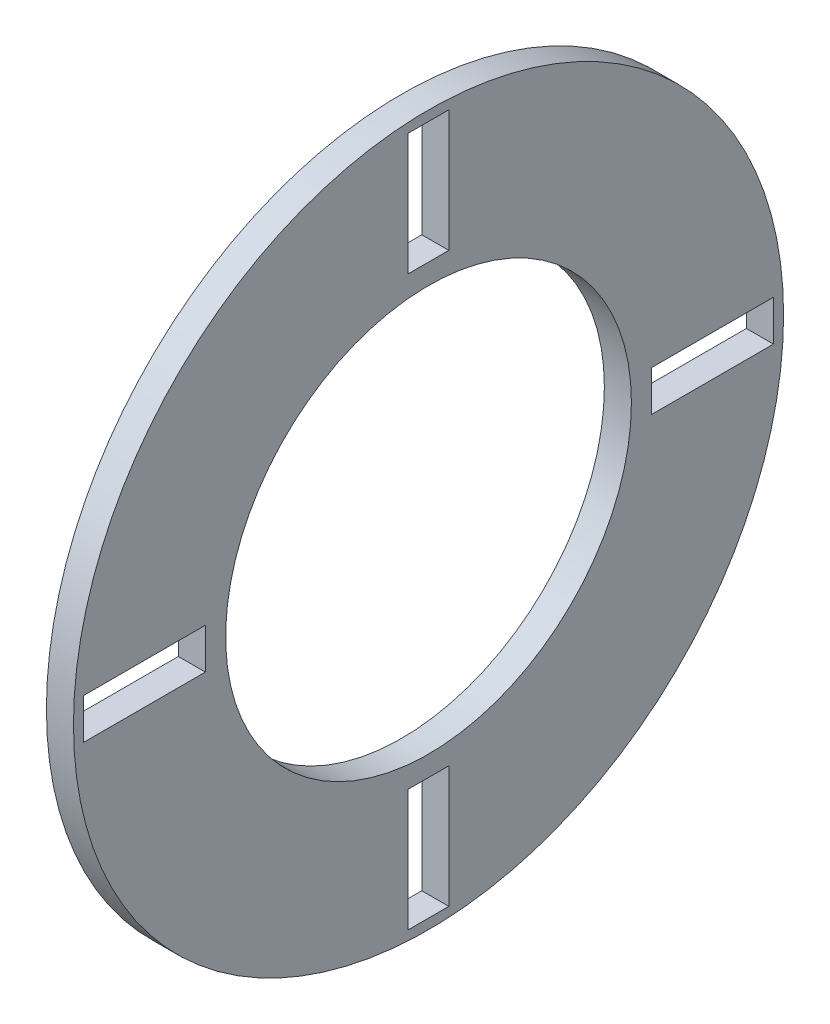
ISO-10303-21;
HEADER;
FILE_DESCRIPTION(('STEP AP214'),'2;1');
FILE_NAME('part.step','',(''),(''),'','','');
FILE_SCHEMA(('AUTOMOTIVE_DESIGN { 1 0 10303 214 1 1 1 1 }'));
ENDSEC;
DATA;
#1=APPLICATION_CONTEXT('core data for automotive mechanical design processes');
#2=APPLICATION_PROTOCOL_DEFINITION('international standard','automotive_design',2000,#1);
#3=PRODUCT_CONTEXT('',#1,'mechanical');
#4=PRODUCT('Part','Part','',(#3));
#5=PRODUCT_RELATED_PRODUCT_CATEGORY('part','',(#4));
#6=PRODUCT_DEFINITION_FORMATION('','',#4);
#7=PRODUCT_DEFINITION_CONTEXT('part definition',#1,'design');
#8=PRODUCT_DEFINITION('design','',#6,#7);
#9=PRODUCT_DEFINITION_SHAPE('','',#8);
#10=(LENGTH_UNIT() NAMED_UNIT(*) SI_UNIT(.MILLI.,.METRE.));
#11=(NAMED_UNIT(*) PLANE_ANGLE_UNIT() SI_UNIT($,.RADIAN.));
#12=(NAMED_UNIT(*) SI_UNIT($,.STERADIAN.) SOLID_ANGLE_UNIT());
#13=UNCERTAINTY_MEASURE_WITH_UNIT(LENGTH_MEASURE(1.E-05),#10,'distance_accuracy_value','');
#14=(GEOMETRIC_REPRESENTATION_CONTEXT(3) GLOBAL_UNCERTAINTY_ASSIGNED_CONTEXT((#13)) GLOBAL_UNIT_ASSIGNED_CONTEXT((#10,
#11,#12)) REPRESENTATION_CONTEXT('',''));
#15=CARTESIAN_POINT('',(0.,0.,0.));
#16=DIRECTION('',(0.,0.,1.));
#17=DIRECTION('',(1.,0.,0.));
#18=AXIS2_PLACEMENT_3D('',#15,#16,#17);
#19=CARTESIAN_POINT('',(1.,0.,0.));
#20=DIRECTION('',(-1.,0.,0.));
#21=DIRECTION('',(0.,0.,1.));
#22=AXIS2_PLACEMENT_3D('',#19,#20,#21);
#23=CYLINDRICAL_SURFACE('',#22,10.);
#24=CARTESIAN_POINT('',(0.33335,0.,0.));
#25=DIRECTION('',(-1.,0.,0.));
#26=DIRECTION('',(0.,0.,1.));
#27=AXIS2_PLACEMENT_3D('',#24,#25,#26);
#28=CIRCLE('',#27,10.);
#29=CARTESIAN_POINT('',(0.33335,0.,-10.));
#30=VERTEX_POINT('',#29);
#31=EDGE_CURVE('E10',#30,#30,#28,.T.);
#32=ORIENTED_EDGE('',*,*,#31,.T.);
#33=EDGE_LOOP('',(#32));
#34=FACE_BOUND('',#33,.T.);
#35=CARTESIAN_POINT('',(1.66665,0.,0.));
#36=DIRECTION('',(-1.,0.,0.));
#37=DIRECTION('',(0.,0.,1.));
#38=AXIS2_PLACEMENT_3D('',#35,#36,#37);
#39=CIRCLE('',#38,10.);
#40=CARTESIAN_POINT('',(1.66665,0.,-10.));
#41=VERTEX_POINT('',#40);
#42=EDGE_CURVE('E323',#41,#41,#39,.T.);
#43=ORIENTED_EDGE('',*,*,#42,.F.);
#44=EDGE_LOOP('',(#43));
#45=FACE_BOUND('',#44,.T.);
#46=ADVANCED_FACE('F16',(#34,#45),#23,.F.);
#47=CARTESIAN_POINT('',(1.,0.,0.));
#48=DIRECTION('',(-1.,0.,0.));
#49=DIRECTION('',(0.,0.,1.));
#50=AXIS2_PLACEMENT_3D('',#47,#48,#49);
#51=CYLINDRICAL_SURFACE('',#50,17.5);
#52=CARTESIAN_POINT('',(0.33335,0.,0.));
#53=DIRECTION('',(-1.,0.,0.));
#54=DIRECTION('',(0.,0.,1.));
#55=AXIS2_PLACEMENT_3D('',#52,#53,#54);
#56=CIRCLE('',#55,17.5);
#57=CARTESIAN_POINT('',(0.33335,0.,-17.5));
#58=VERTEX_POINT('',#57);
#59=EDGE_CURVE('E286',#58,#58,#56,.T.);
#60=ORIENTED_EDGE('',*,*,#59,.F.);
#61=EDGE_LOOP('',(#60));
#62=FACE_BOUND('',#61,.T.);
#63=CARTESIAN_POINT('',(1.66665,0.,0.));
#64=DIRECTION('',(-1.,0.,0.));
#65=DIRECTION('',(0.,0.,1.));
#66=AXIS2_PLACEMENT_3D('',#63,#64,#65);
#67=CIRCLE('',#66,17.5);
#68=CARTESIAN_POINT('',(1.66665,0.,-17.5));
#69=VERTEX_POINT('',#68);
#70=EDGE_CURVE('E27',#69,#69,#67,.T.);
#71=ORIENTED_EDGE('',*,*,#70,.T.);
#72=EDGE_LOOP('',(#71));
#73=FACE_BOUND('',#72,.T.);
#74=ADVANCED_FACE('F504',(#62,#73),#51,.T.);
#75=CARTESIAN_POINT('',(1.,17.,0.));
#76=DIRECTION('',(0.,-1.,0.));
#77=DIRECTION('',(0.,0.,-1.));
#78=AXIS2_PLACEMENT_3D('',#75,#76,#77);
#79=PLANE('',#78);
#80=DIRECTION('',(0.,0.,-1.));
#81=VECTOR('',#80,1.);
#82=CARTESIAN_POINT('',(1.66665,17.,6.875));
#83=LINE('',#82,#81);
#84=CARTESIAN_POINT('',(1.66665,17.,1.));
#85=VERTEX_POINT('',#84);
#86=CARTESIAN_POINT('',(1.66665,17.,-1.));
#87=VERTEX_POINT('',#86);
#88=EDGE_CURVE('E301',#85,#87,#83,.T.);
#89=ORIENTED_EDGE('',*,*,#88,.F.);
#90=DIRECTION('',(-1.,0.,0.));
#91=VECTOR('',#90,1.);
#92=CARTESIAN_POINT('',(1.,17.,1.));
#93=LINE('',#92,#91);
#94=CARTESIAN_POINT('',(0.33335,17.,1.));
#95=VERTEX_POINT('',#94);
#96=EDGE_CURVE('E20',#85,#95,#93,.T.);
#97=ORIENTED_EDGE('',*,*,#96,.T.);
#98=DIRECTION('',(0.,0.,1.));
#99=VECTOR('',#98,1.);
#100=CARTESIAN_POINT('',(0.33335,17.,6.875));
#101=LINE('',#100,#99);
#102=CARTESIAN_POINT('',(0.33335,17.,-1.));
#103=VERTEX_POINT('',#102);
#104=EDGE_CURVE('E257',#103,#95,#101,.T.);
#105=ORIENTED_EDGE('',*,*,#104,.F.);
#106=DIRECTION('',(-1.,0.,0.));
#107=VECTOR('',#106,1.);
#108=CARTESIAN_POINT('',(1.,17.,-1.));
#109=LINE('',#108,#107);
#110=EDGE_CURVE('E272',#87,#103,#109,.T.);
#111=ORIENTED_EDGE('',*,*,#110,.F.);
#112=EDGE_LOOP('',(#89,#97,#105,#111));
#113=FACE_BOUND('',#112,.T.);
#114=ADVANCED_FACE('F413',(#113),#79,.T.);
#115=CARTESIAN_POINT('',(1.,14.,-1.));
#116=DIRECTION('',(0.,0.,1.));
#117=DIRECTION('',(1.,0.,0.));
#118=AXIS2_PLACEMENT_3D('',#115,#116,#117);
#119=PLANE('',#118);
#120=DIRECTION('',(0.,-1.,0.));
#121=VECTOR('',#120,1.);
#122=CARTESIAN_POINT('',(1.66665,7.,-1.));
#123=LINE('',#122,#121);
#124=CARTESIAN_POINT('',(1.66665,11.,-1.));
#125=VERTEX_POINT('',#124);
#126=EDGE_CURVE('E298',#87,#125,#123,.T.);
#127=ORIENTED_EDGE('',*,*,#126,.F.);
#128=ORIENTED_EDGE('',*,*,#110,.T.);
#129=DIRECTION('',(0.,1.,0.));
#130=VECTOR('',#129,1.);
#131=CARTESIAN_POINT('',(0.33335,7.,-1.));
#132=LINE('',#131,#130);
#133=CARTESIAN_POINT('',(0.33335,11.,-1.));
#134=VERTEX_POINT('',#133);
#135=EDGE_CURVE('E260',#134,#103,#132,.T.);
#136=ORIENTED_EDGE('',*,*,#135,.F.);
#137=DIRECTION('',(-1.,0.,0.));
#138=VECTOR('',#137,1.);
#139=CARTESIAN_POINT('',(1.,11.,-1.));
#140=LINE('',#139,#138);
#141=EDGE_CURVE('E253',#125,#134,#140,.T.);
#142=ORIENTED_EDGE('',*,*,#141,.F.);
#143=EDGE_LOOP('',(#127,#128,#136,#142));
#144=FACE_BOUND('',#143,.T.);
#145=ADVANCED_FACE('F409',(#144),#119,.T.);
#146=CARTESIAN_POINT('',(1.,11.,0.));
#147=DIRECTION('',(0.,1.,0.));
#148=DIRECTION('',(1.,0.,0.));
#149=AXIS2_PLACEMENT_3D('',#146,#147,#148);
#150=PLANE('',#149);
#151=DIRECTION('',(0.,0.,1.));
#152=VECTOR('',#151,1.);
#153=CARTESIAN_POINT('',(1.66665,11.,6.875));
#154=LINE('',#153,#152);
#155=CARTESIAN_POINT('',(1.66665,11.,1.));
#156=VERTEX_POINT('',#155);
#157=EDGE_CURVE('E205',#125,#156,#154,.T.);
#158=ORIENTED_EDGE('',*,*,#157,.F.);
#159=ORIENTED_EDGE('',*,*,#141,.T.);
#160=DIRECTION('',(0.,0.,-1.));
#161=VECTOR('',#160,1.);
#162=CARTESIAN_POINT('',(0.33335,11.,6.875));
#163=LINE('',#162,#161);
#164=CARTESIAN_POINT('',(0.33335,11.,1.));
#165=VERTEX_POINT('',#164);
#166=EDGE_CURVE('E282',#165,#134,#163,.T.);
#167=ORIENTED_EDGE('',*,*,#166,.F.);
#168=DIRECTION('',(-1.,0.,0.));
#169=VECTOR('',#168,1.);
#170=CARTESIAN_POINT('',(1.,11.,1.));
#171=LINE('',#170,#169);
#172=EDGE_CURVE('E249',#156,#165,#171,.T.);
#173=ORIENTED_EDGE('',*,*,#172,.F.);
#174=EDGE_LOOP('',(#158,#159,#167,#173));
#175=FACE_BOUND('',#174,.T.);
#176=ADVANCED_FACE('F360',(#175),#150,.T.);
#177=CARTESIAN_POINT('',(1.,14.,1.));
#178=DIRECTION('',(0.,0.,-1.));
#179=DIRECTION('',(0.,-1.,0.));
#180=AXIS2_PLACEMENT_3D('',#177,#178,#179);
#181=PLANE('',#180);
#182=DIRECTION('',(0.,1.,0.));
#183=VECTOR('',#182,1.);
#184=CARTESIAN_POINT('',(1.66665,7.,1.));
#185=LINE('',#184,#183);
#186=EDGE_CURVE('E306',#156,#85,#185,.T.);
#187=ORIENTED_EDGE('',*,*,#186,.F.);
#188=ORIENTED_EDGE('',*,*,#172,.T.);
#189=DIRECTION('',(0.,-1.,0.));
#190=VECTOR('',#189,1.);
#191=CARTESIAN_POINT('',(0.33335,7.,1.));
#192=LINE('',#191,#190);
#193=EDGE_CURVE('E261',#95,#165,#192,.T.);
#194=ORIENTED_EDGE('',*,*,#193,.F.);
#195=ORIENTED_EDGE('',*,*,#96,.F.);
#196=EDGE_LOOP('',(#187,#188,#194,#195));
#197=FACE_BOUND('',#196,.T.);
#198=ADVANCED_FACE('F18',(#197),#181,.T.);
#199=CARTESIAN_POINT('',(1.,0.,-17.));
#200=DIRECTION('',(0.,0.,1.));
#201=DIRECTION('',(1.,0.,0.));
#202=AXIS2_PLACEMENT_3D('',#199,#200,#201);
#203=PLANE('',#202);
#204=DIRECTION('',(0.,-1.,0.));
#205=VECTOR('',#204,1.);
#206=CARTESIAN_POINT('',(1.66665,0.,-17.));
#207=LINE('',#206,#205);
#208=CARTESIAN_POINT('',(1.66665,1.,-17.));
#209=VERTEX_POINT('',#208);
#210=CARTESIAN_POINT('',(1.66665,-1.,-17.));
#211=VERTEX_POINT('',#210);
#212=EDGE_CURVE('E207',#209,#211,#207,.T.);
#213=ORIENTED_EDGE('',*,*,#212,.F.);
#214=DIRECTION('',(-1.,0.,0.));
#215=VECTOR('',#214,1.);
#216=CARTESIAN_POINT('',(1.,1.,-17.));
#217=LINE('',#216,#215);
#218=CARTESIAN_POINT('',(0.33335,1.,-17.));
#219=VERTEX_POINT('',#218);
#220=EDGE_CURVE('E254',#209,#219,#217,.T.);
#221=ORIENTED_EDGE('',*,*,#220,.T.);
#222=DIRECTION('',(0.,1.,0.));
#223=VECTOR('',#222,1.);
#224=CARTESIAN_POINT('',(0.33335,0.,-17.));
#225=LINE('',#224,#223);
#226=CARTESIAN_POINT('',(0.33335,-1.,-17.));
#227=VERTEX_POINT('',#226);
#228=EDGE_CURVE('E233',#227,#219,#225,.T.);
#229=ORIENTED_EDGE('',*,*,#228,.F.);
#230=DIRECTION('',(-1.,0.,0.));
#231=VECTOR('',#230,1.);
#232=CARTESIAN_POINT('',(1.,-1.,-17.));
#233=LINE('',#232,#231);
#234=EDGE_CURVE('E281',#211,#227,#233,.T.);
#235=ORIENTED_EDGE('',*,*,#234,.F.);
#236=EDGE_LOOP('',(#213,#221,#229,#235));
#237=FACE_BOUND('',#236,.T.);
#238=ADVANCED_FACE('F485',(#237),#203,.T.);
#239=CARTESIAN_POINT('',(1.,-1.,-14.));
#240=DIRECTION('',(0.,1.,0.));
#241=DIRECTION('',(1.,0.,0.));
#242=AXIS2_PLACEMENT_3D('',#239,#240,#241);
#243=PLANE('',#242);
#244=DIRECTION('',(0.,0.,1.));
#245=VECTOR('',#244,1.);
#246=CARTESIAN_POINT('',(1.66665,-1.,-0.125));
#247=LINE('',#246,#245);
#248=CARTESIAN_POINT('',(1.66665,-1.,-11.));
#249=VERTEX_POINT('',#248);
#250=EDGE_CURVE('E209',#211,#249,#247,.T.);
#251=ORIENTED_EDGE('',*,*,#250,.F.);
#252=ORIENTED_EDGE('',*,*,#234,.T.);
#253=DIRECTION('',(0.,0.,-1.));
#254=VECTOR('',#253,1.);
#255=CARTESIAN_POINT('',(0.33335,-1.,-0.125));
#256=LINE('',#255,#254);
#257=CARTESIAN_POINT('',(0.33335,-1.,-11.));
#258=VERTEX_POINT('',#257);
#259=EDGE_CURVE('E228',#258,#227,#256,.T.);
#260=ORIENTED_EDGE('',*,*,#259,.F.);
#261=DIRECTION('',(-1.,0.,0.));
#262=VECTOR('',#261,1.);
#263=CARTESIAN_POINT('',(1.,-1.,-11.));
#264=LINE('',#263,#262);
#265=EDGE_CURVE('E238',#249,#258,#264,.T.);
#266=ORIENTED_EDGE('',*,*,#265,.F.);
#267=EDGE_LOOP('',(#251,#252,#260,#266));
#268=FACE_BOUND('',#267,.T.);
#269=ADVANCED_FACE('F480',(#268),#243,.T.);
#270=CARTESIAN_POINT('',(1.,0.,-11.));
#271=DIRECTION('',(0.,0.,-1.));
#272=DIRECTION('',(-1.,0.,0.));
#273=AXIS2_PLACEMENT_3D('',#270,#271,#272);
#274=PLANE('',#273);
#275=DIRECTION('',(0.,1.,0.));
#276=VECTOR('',#275,1.);
#277=CARTESIAN_POINT('',(1.66665,0.,-11.));
#278=LINE('',#277,#276);
#279=CARTESIAN_POINT('',(1.66665,1.,-11.));
#280=VERTEX_POINT('',#279);
#281=EDGE_CURVE('E214',#249,#280,#278,.T.);
#282=ORIENTED_EDGE('',*,*,#281,.F.);
#283=ORIENTED_EDGE('',*,*,#265,.T.);
#284=DIRECTION('',(0.,-1.,0.));
#285=VECTOR('',#284,1.);
#286=CARTESIAN_POINT('',(0.33335,0.,-11.));
#287=LINE('',#286,#285);
#288=CARTESIAN_POINT('',(0.33335,1.,-11.));
#289=VERTEX_POINT('',#288);
#290=EDGE_CURVE('E232',#289,#258,#287,.T.);
#291=ORIENTED_EDGE('',*,*,#290,.F.);
#292=DIRECTION('',(-1.,0.,0.));
#293=VECTOR('',#292,1.);
#294=CARTESIAN_POINT('',(1.,1.,-11.));
#295=LINE('',#294,#293);
#296=EDGE_CURVE('E234',#280,#289,#295,.T.);
#297=ORIENTED_EDGE('',*,*,#296,.F.);
#298=EDGE_LOOP('',(#282,#283,#291,#297));
#299=FACE_BOUND('',#298,.T.);
#300=ADVANCED_FACE('F473',(#299),#274,.T.);
#301=CARTESIAN_POINT('',(1.,1.,-14.));
#302=DIRECTION('',(0.,-1.,0.));
#303=DIRECTION('',(-1.,0.,0.));
#304=AXIS2_PLACEMENT_3D('',#301,#302,#303);
#305=PLANE('',#304);
#306=DIRECTION('',(0.,0.,-1.));
#307=VECTOR('',#306,1.);
#308=CARTESIAN_POINT('',(1.66665,1.,-0.125));
#309=LINE('',#308,#307);
#310=EDGE_CURVE('E208',#280,#209,#309,.T.);
#311=ORIENTED_EDGE('',*,*,#310,.F.);
#312=ORIENTED_EDGE('',*,*,#296,.T.);
#313=DIRECTION('',(0.,0.,1.));
#314=VECTOR('',#313,1.);
#315=CARTESIAN_POINT('',(0.33335,1.,-0.125));
#316=LINE('',#315,#314);
#317=EDGE_CURVE('E244',#219,#289,#316,.T.);
#318=ORIENTED_EDGE('',*,*,#317,.F.);
#319=ORIENTED_EDGE('',*,*,#220,.F.);
#320=EDGE_LOOP('',(#311,#312,#318,#319));
#321=FACE_BOUND('',#320,.T.);
#322=ADVANCED_FACE('F468',(#321),#305,.T.);
#323=CARTESIAN_POINT('',(1.,-17.,0.));
#324=DIRECTION('',(0.,1.,0.));
#325=DIRECTION('',(1.,0.,0.));
#326=AXIS2_PLACEMENT_3D('',#323,#324,#325);
#327=PLANE('',#326);
#328=DIRECTION('',(0.,0.,1.));
#329=VECTOR('',#328,1.);
#330=CARTESIAN_POINT('',(1.66665,-17.,6.875));
#331=LINE('',#330,#329);
#332=CARTESIAN_POINT('',(1.66665,-17.,-1.));
#333=VERTEX_POINT('',#332);
#334=CARTESIAN_POINT('',(1.66665,-17.,1.));
#335=VERTEX_POINT('',#334);
#336=EDGE_CURVE('E262',#333,#335,#331,.T.);
#337=ORIENTED_EDGE('',*,*,#336,.F.);
#338=DIRECTION('',(-1.,0.,0.));
#339=VECTOR('',#338,1.);
#340=CARTESIAN_POINT('',(1.,-17.,-1.));
#341=LINE('',#340,#339);
#342=CARTESIAN_POINT('',(0.33335,-17.,-1.));
#343=VERTEX_POINT('',#342);
#344=EDGE_CURVE('E239',#333,#343,#341,.T.);
#345=ORIENTED_EDGE('',*,*,#344,.T.);
#346=DIRECTION('',(0.,0.,-1.));
#347=VECTOR('',#346,1.);
#348=CARTESIAN_POINT('',(0.33335,-17.,6.875));
#349=LINE('',#348,#347);
#350=CARTESIAN_POINT('',(0.33335,-17.,1.));
#351=VERTEX_POINT('',#350);
#352=EDGE_CURVE('E201',#351,#343,#349,.T.);
#353=ORIENTED_EDGE('',*,*,#352,.F.);
#354=DIRECTION('',(-1.,0.,0.));
#355=VECTOR('',#354,1.);
#356=CARTESIAN_POINT('',(1.,-17.,1.));
#357=LINE('',#356,#355);
#358=EDGE_CURVE('E307',#335,#351,#357,.T.);
#359=ORIENTED_EDGE('',*,*,#358,.F.);
#360=EDGE_LOOP('',(#337,#345,#353,#359));
#361=FACE_BOUND('',#360,.T.);
#362=ADVANCED_FACE('F376',(#361),#327,.T.);
#363=CARTESIAN_POINT('',(1.,-14.,1.));
#364=DIRECTION('',(0.,0.,-1.));
#365=DIRECTION('',(0.,-1.,0.));
#366=AXIS2_PLACEMENT_3D('',#363,#364,#365);
#367=PLANE('',#366);
#368=DIRECTION('',(0.,1.,0.));
#369=VECTOR('',#368,1.);
#370=CARTESIAN_POINT('',(1.66665,-7.,1.));
#371=LINE('',#370,#369);
#372=CARTESIAN_POINT('',(1.66665,-11.,1.));
#373=VERTEX_POINT('',#372);
#374=EDGE_CURVE('E266',#335,#373,#371,.T.);
#375=ORIENTED_EDGE('',*,*,#374,.F.);
#376=ORIENTED_EDGE('',*,*,#358,.T.);
#377=DIRECTION('',(0.,-1.,0.));
#378=VECTOR('',#377,1.);
#379=CARTESIAN_POINT('',(0.33335,-7.,1.));
#380=LINE('',#379,#378);
#381=CARTESIAN_POINT('',(0.33335,-11.,1.));
#382=VERTEX_POINT('',#381);
#383=EDGE_CURVE('E245',#382,#351,#380,.T.);
#384=ORIENTED_EDGE('',*,*,#383,.F.);
#385=DIRECTION('',(-1.,0.,0.));
#386=VECTOR('',#385,1.);
#387=CARTESIAN_POINT('',(1.,-11.,1.));
#388=LINE('',#387,#386);
#389=EDGE_CURVE('E226',#373,#382,#388,.T.);
#390=ORIENTED_EDGE('',*,*,#389,.F.);
#391=EDGE_LOOP('',(#375,#376,#384,#390));
#392=FACE_BOUND('',#391,.T.);
#393=ADVANCED_FACE('F382',(#392),#367,.T.);
#394=CARTESIAN_POINT('',(1.,-11.,0.));
#395=DIRECTION('',(0.,-1.,0.));
#396=DIRECTION('',(-1.,0.,0.));
#397=AXIS2_PLACEMENT_3D('',#394,#395,#396);
#398=PLANE('',#397);
#399=DIRECTION('',(0.,0.,-1.));
#400=VECTOR('',#399,1.);
#401=CARTESIAN_POINT('',(1.66665,-11.,6.875));
#402=LINE('',#401,#400);
#403=CARTESIAN_POINT('',(1.66665,-11.,-1.));
#404=VERTEX_POINT('',#403);
#405=EDGE_CURVE('E314',#373,#404,#402,.T.);
#406=ORIENTED_EDGE('',*,*,#405,.F.);
#407=ORIENTED_EDGE('',*,*,#389,.T.);
#408=DIRECTION('',(0.,0.,1.));
#409=VECTOR('',#408,1.);
#410=CARTESIAN_POINT('',(0.33335,-11.,6.875));
#411=LINE('',#410,#409);
#412=CARTESIAN_POINT('',(0.33335,-11.,-1.));
#413=VERTEX_POINT('',#412);
#414=EDGE_CURVE('E240',#413,#382,#411,.T.);
#415=ORIENTED_EDGE('',*,*,#414,.F.);
#416=DIRECTION('',(-1.,0.,0.));
#417=VECTOR('',#416,1.);
#418=CARTESIAN_POINT('',(1.,-11.,-1.));
#419=LINE('',#418,#417);
#420=EDGE_CURVE('E222',#404,#413,#419,.T.);
#421=ORIENTED_EDGE('',*,*,#420,.F.);
#422=EDGE_LOOP('',(#406,#407,#415,#421));
#423=FACE_BOUND('',#422,.T.);
#424=ADVANCED_FACE('F388',(#423),#398,.T.);
#425=CARTESIAN_POINT('',(1.,-14.,-1.));
#426=DIRECTION('',(0.,0.,1.));
#427=DIRECTION('',(1.,0.,0.));
#428=AXIS2_PLACEMENT_3D('',#425,#426,#427);
#429=PLANE('',#428);
#430=DIRECTION('',(0.,-1.,0.));
#431=VECTOR('',#430,1.);
#432=CARTESIAN_POINT('',(1.66665,-7.,-1.));
#433=LINE('',#432,#431);
#434=EDGE_CURVE('E265',#404,#333,#433,.T.);
#435=ORIENTED_EDGE('',*,*,#434,.F.);
#436=ORIENTED_EDGE('',*,*,#420,.T.);
#437=DIRECTION('',(0.,1.,0.));
#438=VECTOR('',#437,1.);
#439=CARTESIAN_POINT('',(0.33335,-7.,-1.));
#440=LINE('',#439,#438);
#441=EDGE_CURVE('E194',#343,#413,#440,.T.);
#442=ORIENTED_EDGE('',*,*,#441,.F.);
#443=ORIENTED_EDGE('',*,*,#344,.F.);
#444=EDGE_LOOP('',(#435,#436,#442,#443));
#445=FACE_BOUND('',#444,.T.);
#446=ADVANCED_FACE('F391',(#445),#429,.T.);
#447=CARTESIAN_POINT('',(1.,0.,17.));
#448=DIRECTION('',(0.,0.,-1.));
#449=DIRECTION('',(0.,-1.,0.));
#450=AXIS2_PLACEMENT_3D('',#447,#448,#449);
#451=PLANE('',#450);
#452=DIRECTION('',(0.,1.,0.));
#453=VECTOR('',#452,1.);
#454=CARTESIAN_POINT('',(1.66665,0.,17.));
#455=LINE('',#454,#453);
#456=CARTESIAN_POINT('',(1.66665,-1.,17.));
#457=VERTEX_POINT('',#456);
#458=CARTESIAN_POINT('',(1.66665,1.,17.));
#459=VERTEX_POINT('',#458);
#460=EDGE_CURVE('E219',#457,#459,#455,.T.);
#461=ORIENTED_EDGE('',*,*,#460,.F.);
#462=DIRECTION('',(-1.,0.,0.));
#463=VECTOR('',#462,1.);
#464=CARTESIAN_POINT('',(1.,-1.,17.));
#465=LINE('',#464,#463);
#466=CARTESIAN_POINT('',(0.33335,-1.,17.));
#467=VERTEX_POINT('',#466);
#468=EDGE_CURVE('E227',#457,#467,#465,.T.);
#469=ORIENTED_EDGE('',*,*,#468,.T.);
#470=DIRECTION('',(0.,-1.,0.));
#471=VECTOR('',#470,1.);
#472=CARTESIAN_POINT('',(0.33335,0.,17.));
#473=LINE('',#472,#471);
#474=CARTESIAN_POINT('',(0.33335,1.,17.));
#475=VERTEX_POINT('',#474);
#476=EDGE_CURVE('E182',#475,#467,#473,.T.);
#477=ORIENTED_EDGE('',*,*,#476,.F.);
#478=DIRECTION('',(-1.,0.,0.));
#479=VECTOR('',#478,1.);
#480=CARTESIAN_POINT('',(1.,1.,17.));
#481=LINE('',#480,#479);
#482=EDGE_CURVE('E178',#459,#475,#481,.T.);
#483=ORIENTED_EDGE('',*,*,#482,.F.);
#484=EDGE_LOOP('',(#461,#469,#477,#483));
#485=FACE_BOUND('',#484,.T.);
#486=ADVANCED_FACE('F418',(#485),#451,.T.);
#487=CARTESIAN_POINT('',(1.,1.,14.));
#488=DIRECTION('',(0.,-1.,0.));
#489=DIRECTION('',(-1.,0.,0.));
#490=AXIS2_PLACEMENT_3D('',#487,#488,#489);
#491=PLANE('',#490);
#492=DIRECTION('',(0.,0.,-1.));
#493=VECTOR('',#492,1.);
#494=CARTESIAN_POINT('',(1.66665,1.,13.875));
#495=LINE('',#494,#493);
#496=CARTESIAN_POINT('',(1.66665,1.,11.));
#497=VERTEX_POINT('',#496);
#498=EDGE_CURVE('E165',#459,#497,#495,.T.);
#499=ORIENTED_EDGE('',*,*,#498,.F.);
#500=ORIENTED_EDGE('',*,*,#482,.T.);
#501=DIRECTION('',(0.,0.,1.));
#502=VECTOR('',#501,1.);
#503=CARTESIAN_POINT('',(0.33335,1.,13.875));
#504=LINE('',#503,#502);
#505=CARTESIAN_POINT('',(0.33335,1.,11.));
#506=VERTEX_POINT('',#505);
#507=EDGE_CURVE('E173',#506,#475,#504,.T.);
#508=ORIENTED_EDGE('',*,*,#507,.F.);
#509=DIRECTION('',(-1.,0.,0.));
#510=VECTOR('',#509,1.);
#511=CARTESIAN_POINT('',(1.,1.,11.));
#512=LINE('',#511,#510);
#513=EDGE_CURVE('E175',#497,#506,#512,.T.);
#514=ORIENTED_EDGE('',*,*,#513,.F.);
#515=EDGE_LOOP('',(#499,#500,#508,#514));
#516=FACE_BOUND('',#515,.T.);
#517=ADVANCED_FACE('F174',(#516),#491,.T.);
#518=CARTESIAN_POINT('',(1.,0.,11.));
#519=DIRECTION('',(0.,0.,1.));
#520=DIRECTION('',(1.,0.,0.));
#521=AXIS2_PLACEMENT_3D('',#518,#519,#520);
#522=PLANE('',#521);
#523=DIRECTION('',(0.,-1.,0.));
#524=VECTOR('',#523,1.);
#525=CARTESIAN_POINT('',(1.66665,0.,11.));
#526=LINE('',#525,#524);
#527=CARTESIAN_POINT('',(1.66665,-1.,11.));
#528=VERTEX_POINT('',#527);
#529=EDGE_CURVE('E185',#497,#528,#526,.T.);
#530=ORIENTED_EDGE('',*,*,#529,.F.);
#531=ORIENTED_EDGE('',*,*,#513,.T.);
#532=DIRECTION('',(0.,1.,0.));
#533=VECTOR('',#532,1.);
#534=CARTESIAN_POINT('',(0.33335,0.,11.));
#535=LINE('',#534,#533);
#536=CARTESIAN_POINT('',(0.33335,-1.,11.));
#537=VERTEX_POINT('',#536);
#538=EDGE_CURVE('E158',#537,#506,#535,.T.);
#539=ORIENTED_EDGE('',*,*,#538,.F.);
#540=DIRECTION('',(-1.,0.,0.));
#541=VECTOR('',#540,1.);
#542=CARTESIAN_POINT('',(1.,-1.,11.));
#543=LINE('',#542,#541);
#544=EDGE_CURVE('E187',#528,#537,#543,.T.);
#545=ORIENTED_EDGE('',*,*,#544,.F.);
#546=EDGE_LOOP('',(#530,#531,#539,#545));
#547=FACE_BOUND('',#546,.T.);
#548=ADVANCED_FACE('F184',(#547),#522,.T.);
#549=CARTESIAN_POINT('',(1.,-1.,14.));
#550=DIRECTION('',(0.,1.,0.));
#551=DIRECTION('',(1.,0.,0.));
#552=AXIS2_PLACEMENT_3D('',#549,#550,#551);
#553=PLANE('',#552);
#554=DIRECTION('',(0.,0.,1.));
#555=VECTOR('',#554,1.);
#556=CARTESIAN_POINT('',(1.66665,-1.,13.875));
#557=LINE('',#556,#555);
#558=EDGE_CURVE('E215',#528,#457,#557,.T.);
#559=ORIENTED_EDGE('',*,*,#558,.F.);
#560=ORIENTED_EDGE('',*,*,#544,.T.);
#561=DIRECTION('',(0.,0.,-1.));
#562=VECTOR('',#561,1.);
#563=CARTESIAN_POINT('',(0.33335,-1.,13.875));
#564=LINE('',#563,#562);
#565=EDGE_CURVE('E192',#467,#537,#564,.T.);
#566=ORIENTED_EDGE('',*,*,#565,.F.);
#567=ORIENTED_EDGE('',*,*,#468,.F.);
#568=EDGE_LOOP('',(#559,#560,#566,#567));
#569=FACE_BOUND('',#568,.T.);
#570=ADVANCED_FACE('F439',(#569),#553,.T.);
#571=CARTESIAN_POINT('',(1.66665,0.,13.75));
#572=DIRECTION('',(1.,0.,0.));
#573=DIRECTION('',(0.,1.,0.));
#574=AXIS2_PLACEMENT_3D('',#571,#572,#573);
#575=PLANE('',#574);
#576=ORIENTED_EDGE('',*,*,#70,.F.);
#577=EDGE_LOOP('',(#576));
#578=FACE_BOUND('',#577,.T.);
#579=ORIENTED_EDGE('',*,*,#157,.T.);
#580=ORIENTED_EDGE('',*,*,#186,.T.);
#581=ORIENTED_EDGE('',*,*,#88,.T.);
#582=ORIENTED_EDGE('',*,*,#126,.T.);
#583=EDGE_LOOP('',(#579,#580,#581,#582));
#584=FACE_BOUND('',#583,.T.);
#585=ORIENTED_EDGE('',*,*,#281,.T.);
#586=ORIENTED_EDGE('',*,*,#310,.T.);
#587=ORIENTED_EDGE('',*,*,#212,.T.);
#588=ORIENTED_EDGE('',*,*,#250,.T.);
#589=EDGE_LOOP('',(#585,#586,#587,#588));
#590=FACE_BOUND('',#589,.T.);
#591=ORIENTED_EDGE('',*,*,#405,.T.);
#592=ORIENTED_EDGE('',*,*,#434,.T.);
#593=ORIENTED_EDGE('',*,*,#336,.T.);
#594=ORIENTED_EDGE('',*,*,#374,.T.);
#595=EDGE_LOOP('',(#591,#592,#593,#594));
#596=FACE_BOUND('',#595,.T.);
#597=ORIENTED_EDGE('',*,*,#529,.T.);
#598=ORIENTED_EDGE('',*,*,#558,.T.);
#599=ORIENTED_EDGE('',*,*,#460,.T.);
#600=ORIENTED_EDGE('',*,*,#498,.T.);
#601=EDGE_LOOP('',(#597,#598,#599,#600));
#602=FACE_BOUND('',#601,.T.);
#603=ORIENTED_EDGE('',*,*,#42,.T.);
#604=EDGE_LOOP('',(#603));
#605=FACE_BOUND('',#604,.T.);
#606=ADVANCED_FACE('F444',(#578,#584,#590,#596,#602,#605),#575,.T.);
#607=CARTESIAN_POINT('',(0.33335,0.,13.75));
#608=DIRECTION('',(-1.,0.,0.));
#609=DIRECTION('',(0.,1.,0.));
#610=AXIS2_PLACEMENT_3D('',#607,#608,#609);
#611=PLANE('',#610);
#612=ORIENTED_EDGE('',*,*,#59,.T.);
#613=EDGE_LOOP('',(#612));
#614=FACE_BOUND('',#613,.T.);
#615=ORIENTED_EDGE('',*,*,#166,.T.);
#616=ORIENTED_EDGE('',*,*,#135,.T.);
#617=ORIENTED_EDGE('',*,*,#104,.T.);
#618=ORIENTED_EDGE('',*,*,#193,.T.);
#619=EDGE_LOOP('',(#615,#616,#617,#618));
#620=FACE_BOUND('',#619,.T.);
#621=ORIENTED_EDGE('',*,*,#290,.T.);
#622=ORIENTED_EDGE('',*,*,#259,.T.);
#623=ORIENTED_EDGE('',*,*,#228,.T.);
#624=ORIENTED_EDGE('',*,*,#317,.T.);
#625=EDGE_LOOP('',(#621,#622,#623,#624));
#626=FACE_BOUND('',#625,.T.);
#627=ORIENTED_EDGE('',*,*,#414,.T.);
#628=ORIENTED_EDGE('',*,*,#383,.T.);
#629=ORIENTED_EDGE('',*,*,#352,.T.);
#630=ORIENTED_EDGE('',*,*,#441,.T.);
#631=EDGE_LOOP('',(#627,#628,#629,#630));
#632=FACE_BOUND('',#631,.T.);
#633=ORIENTED_EDGE('',*,*,#538,.T.);
#634=ORIENTED_EDGE('',*,*,#507,.T.);
#635=ORIENTED_EDGE('',*,*,#476,.T.);
#636=ORIENTED_EDGE('',*,*,#565,.T.);
#637=EDGE_LOOP('',(#633,#634,#635,#636));
#638=FACE_BOUND('',#637,.T.);
#639=ORIENTED_EDGE('',*,*,#31,.F.);
#640=EDGE_LOOP('',(#639));
#641=FACE_BOUND('',#640,.T.);
#642=ADVANCED_FACE('F190',(#614,#620,#626,#632,#638,#641),#611,.T.);
#643=CLOSED_SHELL('',(#46,#74,#114,#145,#176,#198,#238,#269,#300,#322,#362,#393,#424,#446,#486,
#517,#548,#570,#606,#642));
#644=MANIFOLD_SOLID_BREP('B1',#643);
#645=ADVANCED_BREP_SHAPE_REPRESENTATION('',(#18,#644),#14);
#646=SHAPE_DEFINITION_REPRESENTATION(#9,#645);
ENDSEC;
END-ISO-10303-21;
